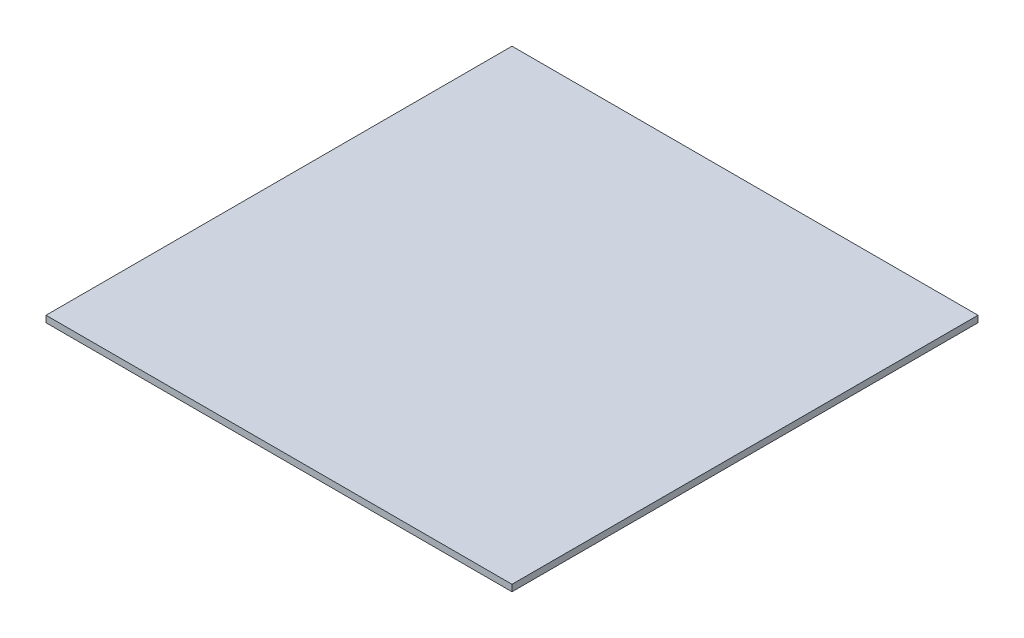
ISO-10303-21;
HEADER;
FILE_DESCRIPTION(('STEP AP214'),'2;1');
FILE_NAME('part.step','',(''),(''),'','','');
FILE_SCHEMA(('AUTOMOTIVE_DESIGN { 1 0 10303 214 1 1 1 1 }'));
ENDSEC;
DATA;
#1=APPLICATION_CONTEXT('core data for automotive mechanical design processes');
#2=APPLICATION_PROTOCOL_DEFINITION('international standard','automotive_design',2000,#1);
#3=PRODUCT_CONTEXT('',#1,'mechanical');
#4=PRODUCT('Part','Part','',(#3));
#5=PRODUCT_RELATED_PRODUCT_CATEGORY('part','',(#4));
#6=PRODUCT_DEFINITION_FORMATION('','',#4);
#7=PRODUCT_DEFINITION_CONTEXT('part definition',#1,'design');
#8=PRODUCT_DEFINITION('design','',#6,#7);
#9=PRODUCT_DEFINITION_SHAPE('','',#8);
#10=(LENGTH_UNIT() NAMED_UNIT(*) SI_UNIT(.MILLI.,.METRE.));
#11=(NAMED_UNIT(*) PLANE_ANGLE_UNIT() SI_UNIT($,.RADIAN.));
#12=(NAMED_UNIT(*) SI_UNIT($,.STERADIAN.) SOLID_ANGLE_UNIT());
#13=UNCERTAINTY_MEASURE_WITH_UNIT(LENGTH_MEASURE(1.E-05),#10,'distance_accuracy_value','');
#14=(GEOMETRIC_REPRESENTATION_CONTEXT(3) GLOBAL_UNCERTAINTY_ASSIGNED_CONTEXT((#13)) GLOBAL_UNIT_ASSIGNED_CONTEXT((#10,
#11,#12)) REPRESENTATION_CONTEXT('',''));
#15=CARTESIAN_POINT('',(0.,0.,0.));
#16=DIRECTION('',(0.,0.,1.));
#17=DIRECTION('',(1.,0.,0.));
#18=AXIS2_PLACEMENT_3D('',#15,#16,#17);
#19=CARTESIAN_POINT('',(0.,3.,0.));
#20=DIRECTION('',(1.,0.,0.));
#21=DIRECTION('',(0.,0.,-1.));
#22=AXIS2_PLACEMENT_3D('',#19,#20,#21);
#23=PLANE('',#22);
#24=DIRECTION('',(0.,0.,1.));
#25=VECTOR('',#24,1.);
#26=CARTESIAN_POINT('',(0.,0.,0.));
#27=LINE('',#26,#25);
#28=CARTESIAN_POINT('',(0.,0.,-214.));
#29=VERTEX_POINT('',#28);
#30=CARTESIAN_POINT('',(0.,0.,0.));
#31=VERTEX_POINT('',#30);
#32=EDGE_CURVE('E96',#29,#31,#27,.T.);
#33=ORIENTED_EDGE('',*,*,#32,.T.);
#34=DIRECTION('',(0.,-1.,0.));
#35=VECTOR('',#34,1.);
#36=CARTESIAN_POINT('',(0.,3.,0.));
#37=LINE('',#36,#35);
#38=CARTESIAN_POINT('',(0.,3.,0.));
#39=VERTEX_POINT('',#38);
#40=EDGE_CURVE('E11',#39,#31,#37,.T.);
#41=ORIENTED_EDGE('',*,*,#40,.F.);
#42=DIRECTION('',(0.,0.,1.));
#43=VECTOR('',#42,1.);
#44=CARTESIAN_POINT('',(0.,3.,0.));
#45=LINE('',#44,#43);
#46=CARTESIAN_POINT('',(0.,3.,-214.));
#47=VERTEX_POINT('',#46);
#48=EDGE_CURVE('E84',#47,#39,#45,.T.);
#49=ORIENTED_EDGE('',*,*,#48,.F.);
#50=DIRECTION('',(0.,-1.,0.));
#51=VECTOR('',#50,1.);
#52=CARTESIAN_POINT('',(0.,3.,-214.));
#53=LINE('',#52,#51);
#54=EDGE_CURVE('E92',#47,#29,#53,.T.);
#55=ORIENTED_EDGE('',*,*,#54,.T.);
#56=EDGE_LOOP('',(#33,#41,#49,#55));
#57=FACE_BOUND('',#56,.T.);
#58=ADVANCED_FACE('F33',(#57),#23,.F.);
#59=CARTESIAN_POINT('',(0.,3.,0.));
#60=DIRECTION('',(0.,0.,-1.));
#61=DIRECTION('',(-1.,0.,0.));
#62=AXIS2_PLACEMENT_3D('',#59,#60,#61);
#63=PLANE('',#62);
#64=DIRECTION('',(1.,0.,0.));
#65=VECTOR('',#64,1.);
#66=CARTESIAN_POINT('',(0.,0.,0.));
#67=LINE('',#66,#65);
#68=CARTESIAN_POINT('',(214.,0.,0.));
#69=VERTEX_POINT('',#68);
#70=EDGE_CURVE('E88',#31,#69,#67,.T.);
#71=ORIENTED_EDGE('',*,*,#70,.T.);
#72=DIRECTION('',(0.,-1.,0.));
#73=VECTOR('',#72,1.);
#74=CARTESIAN_POINT('',(214.,3.,0.));
#75=LINE('',#74,#73);
#76=CARTESIAN_POINT('',(214.,3.,0.));
#77=VERTEX_POINT('',#76);
#78=EDGE_CURVE('E41',#77,#69,#75,.T.);
#79=ORIENTED_EDGE('',*,*,#78,.F.);
#80=DIRECTION('',(1.,0.,0.));
#81=VECTOR('',#80,1.);
#82=CARTESIAN_POINT('',(0.,3.,0.));
#83=LINE('',#82,#81);
#84=EDGE_CURVE('E79',#39,#77,#83,.T.);
#85=ORIENTED_EDGE('',*,*,#84,.F.);
#86=ORIENTED_EDGE('',*,*,#40,.T.);
#87=EDGE_LOOP('',(#71,#79,#85,#86));
#88=FACE_BOUND('',#87,.T.);
#89=ADVANCED_FACE('F87',(#88),#63,.F.);
#90=CARTESIAN_POINT('',(214.,3.,0.));
#91=DIRECTION('',(-1.,0.,0.));
#92=DIRECTION('',(0.,0.,1.));
#93=AXIS2_PLACEMENT_3D('',#90,#91,#92);
#94=PLANE('',#93);
#95=DIRECTION('',(0.,0.,-1.));
#96=VECTOR('',#95,1.);
#97=CARTESIAN_POINT('',(214.,0.,0.));
#98=LINE('',#97,#96);
#99=CARTESIAN_POINT('',(214.,0.,-214.));
#100=VERTEX_POINT('',#99);
#101=EDGE_CURVE('E66',#69,#100,#98,.T.);
#102=ORIENTED_EDGE('',*,*,#101,.T.);
#103=DIRECTION('',(0.,-1.,0.));
#104=VECTOR('',#103,1.);
#105=CARTESIAN_POINT('',(214.,3.,-214.));
#106=LINE('',#105,#104);
#107=CARTESIAN_POINT('',(214.,3.,-214.));
#108=VERTEX_POINT('',#107);
#109=EDGE_CURVE('E89',#108,#100,#106,.T.);
#110=ORIENTED_EDGE('',*,*,#109,.F.);
#111=DIRECTION('',(0.,0.,-1.));
#112=VECTOR('',#111,1.);
#113=CARTESIAN_POINT('',(214.,3.,0.));
#114=LINE('',#113,#112);
#115=EDGE_CURVE('E82',#77,#108,#114,.T.);
#116=ORIENTED_EDGE('',*,*,#115,.F.);
#117=ORIENTED_EDGE('',*,*,#78,.T.);
#118=EDGE_LOOP('',(#102,#110,#116,#117));
#119=FACE_BOUND('',#118,.T.);
#120=ADVANCED_FACE('F90',(#119),#94,.F.);
#121=CARTESIAN_POINT('',(0.,3.,-214.));
#122=DIRECTION('',(0.,0.,1.));
#123=DIRECTION('',(1.,0.,0.));
#124=AXIS2_PLACEMENT_3D('',#121,#122,#123);
#125=PLANE('',#124);
#126=DIRECTION('',(-1.,0.,0.));
#127=VECTOR('',#126,1.);
#128=CARTESIAN_POINT('',(0.,0.,-214.));
#129=LINE('',#128,#127);
#130=EDGE_CURVE('E72',#100,#29,#129,.T.);
#131=ORIENTED_EDGE('',*,*,#130,.T.);
#132=ORIENTED_EDGE('',*,*,#54,.F.);
#133=DIRECTION('',(-1.,0.,0.));
#134=VECTOR('',#133,1.);
#135=CARTESIAN_POINT('',(0.,3.,-214.));
#136=LINE('',#135,#134);
#137=EDGE_CURVE('E49',#108,#47,#136,.T.);
#138=ORIENTED_EDGE('',*,*,#137,.F.);
#139=ORIENTED_EDGE('',*,*,#109,.T.);
#140=EDGE_LOOP('',(#131,#132,#138,#139));
#141=FACE_BOUND('',#140,.T.);
#142=ADVANCED_FACE('F103',(#141),#125,.F.);
#143=CARTESIAN_POINT('',(0.,3.,0.));
#144=DIRECTION('',(0.,-1.,0.));
#145=DIRECTION('',(0.,0.,-1.));
#146=AXIS2_PLACEMENT_3D('',#143,#144,#145);
#147=PLANE('',#146);
#148=ORIENTED_EDGE('',*,*,#48,.T.);
#149=ORIENTED_EDGE('',*,*,#84,.T.);
#150=ORIENTED_EDGE('',*,*,#115,.T.);
#151=ORIENTED_EDGE('',*,*,#137,.T.);
#152=EDGE_LOOP('',(#148,#149,#150,#151));
#153=FACE_BOUND('',#152,.T.);
#154=ADVANCED_FACE('F80',(#153),#147,.F.);
#155=CARTESIAN_POINT('',(0.,0.,0.));
#156=DIRECTION('',(0.,-1.,0.));
#157=DIRECTION('',(0.,0.,-1.));
#158=AXIS2_PLACEMENT_3D('',#155,#156,#157);
#159=PLANE('',#158);
#160=ORIENTED_EDGE('',*,*,#32,.F.);
#161=ORIENTED_EDGE('',*,*,#130,.F.);
#162=ORIENTED_EDGE('',*,*,#101,.F.);
#163=ORIENTED_EDGE('',*,*,#70,.F.);
#164=EDGE_LOOP('',(#160,#161,#162,#163));
#165=FACE_BOUND('',#164,.T.);
#166=ADVANCED_FACE('F106',(#165),#159,.T.);
#167=CLOSED_SHELL('',(#58,#89,#120,#142,#154,#166));
#168=MANIFOLD_SOLID_BREP('B2',#167);
#169=ADVANCED_BREP_SHAPE_REPRESENTATION('',(#18,#168),#14);
#170=SHAPE_DEFINITION_REPRESENTATION(#9,#169);
ENDSEC;
END-ISO-10303-21;
